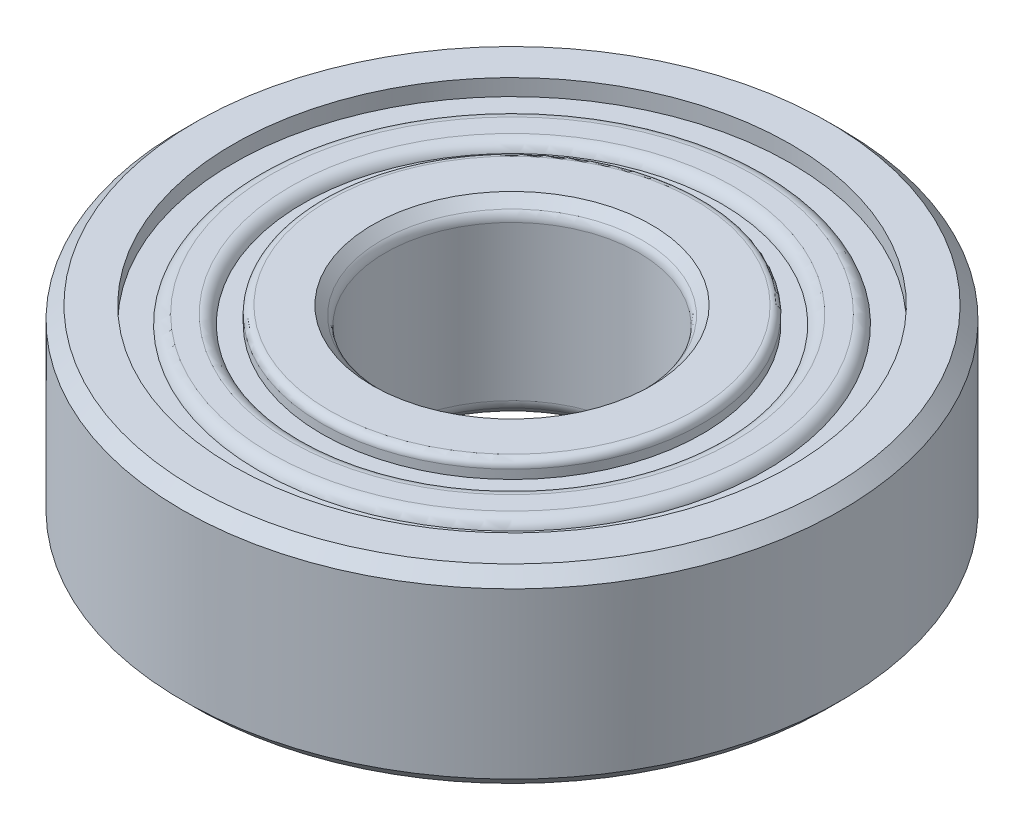
ISO-10303-21;
HEADER;
FILE_DESCRIPTION(('STEP AP214'),'2;1');
FILE_NAME('part.step','',(''),(''),'','','');
FILE_SCHEMA(('AUTOMOTIVE_DESIGN { 1 0 10303 214 1 1 1 1 }'));
ENDSEC;
DATA;
#1=APPLICATION_CONTEXT('core data for automotive mechanical design processes');
#2=APPLICATION_PROTOCOL_DEFINITION('international standard','automotive_design',2000,#1);
#3=PRODUCT_CONTEXT('',#1,'mechanical');
#4=PRODUCT('Part','Part','',(#3));
#5=PRODUCT_RELATED_PRODUCT_CATEGORY('part','',(#4));
#6=PRODUCT_DEFINITION_FORMATION('','',#4);
#7=PRODUCT_DEFINITION_CONTEXT('part definition',#1,'design');
#8=PRODUCT_DEFINITION('design','',#6,#7);
#9=PRODUCT_DEFINITION_SHAPE('','',#8);
#10=(LENGTH_UNIT() NAMED_UNIT(*) SI_UNIT(.MILLI.,.METRE.));
#11=(NAMED_UNIT(*) PLANE_ANGLE_UNIT() SI_UNIT($,.RADIAN.));
#12=(NAMED_UNIT(*) SI_UNIT($,.STERADIAN.) SOLID_ANGLE_UNIT());
#13=UNCERTAINTY_MEASURE_WITH_UNIT(LENGTH_MEASURE(1.E-05),#10,'distance_accuracy_value','');
#14=(GEOMETRIC_REPRESENTATION_CONTEXT(3) GLOBAL_UNCERTAINTY_ASSIGNED_CONTEXT((#13)) GLOBAL_UNIT_ASSIGNED_CONTEXT((#10,
#11,#12)) REPRESENTATION_CONTEXT('',''));
#15=CARTESIAN_POINT('',(0.,0.,0.));
#16=DIRECTION('',(0.,0.,1.));
#17=DIRECTION('',(1.,0.,0.));
#18=AXIS2_PLACEMENT_3D('',#15,#16,#17);
#19=CARTESIAN_POINT('',(0.,7.5,0.));
#20=DIRECTION('',(0.,-1.,0.));
#21=DIRECTION('',(0.,0.,-1.));
#22=AXIS2_PLACEMENT_3D('',#19,#20,#21);
#23=CYLINDRICAL_SURFACE('',#22,26.);
#24=CARTESIAN_POINT('',(0.,-6.49999999999998,0.));
#25=DIRECTION('',(0.,-1.,0.));
#26=DIRECTION('',(0.,0.,-1.));
#27=AXIS2_PLACEMENT_3D('',#24,#25,#26);
#28=CIRCLE('',#27,26.);
#29=CARTESIAN_POINT('',(0.,-6.49999999999998,-26.));
#30=VERTEX_POINT('',#29);
#31=EDGE_CURVE('E79',#30,#30,#28,.F.);
#32=ORIENTED_EDGE('',*,*,#31,.T.);
#33=EDGE_LOOP('',(#32));
#34=FACE_BOUND('',#33,.T.);
#35=CARTESIAN_POINT('',(0.,6.50000000000001,0.));
#36=DIRECTION('',(0.,1.,0.));
#37=DIRECTION('',(0.,0.,1.));
#38=AXIS2_PLACEMENT_3D('',#35,#36,#37);
#39=CIRCLE('',#38,26.);
#40=CARTESIAN_POINT('',(0.,6.50000000000001,26.));
#41=VERTEX_POINT('',#40);
#42=EDGE_CURVE('E119',#41,#41,#39,.F.);
#43=ORIENTED_EDGE('',*,*,#42,.T.);
#44=EDGE_LOOP('',(#43));
#45=FACE_BOUND('',#44,.T.);
#46=ADVANCED_FACE('F39',(#34,#45),#23,.T.);
#47=CARTESIAN_POINT('',(0.,7.5,0.));
#48=DIRECTION('',(0.,1.,0.));
#49=DIRECTION('',(0.,0.,1.));
#50=AXIS2_PLACEMENT_3D('',#47,#48,#49);
#51=PLANE('',#50);
#52=CARTESIAN_POINT('',(0.,7.5,0.));
#53=DIRECTION('',(0.,1.,0.));
#54=DIRECTION('',(0.,0.,1.));
#55=AXIS2_PLACEMENT_3D('',#52,#53,#54);
#56=CIRCLE('',#55,25.);
#57=CARTESIAN_POINT('',(0.,7.5,25.));
#58=VERTEX_POINT('',#57);
#59=EDGE_CURVE('E123',#58,#58,#56,.T.);
#60=ORIENTED_EDGE('',*,*,#59,.T.);
#61=EDGE_LOOP('',(#60));
#62=FACE_BOUND('',#61,.T.);
#63=CARTESIAN_POINT('',(0.,7.5,0.));
#64=DIRECTION('',(0.,1.,0.));
#65=DIRECTION('',(0.,0.,1.));
#66=AXIS2_PLACEMENT_3D('',#63,#64,#65);
#67=CIRCLE('',#66,22.);
#68=CARTESIAN_POINT('',(0.,7.5,22.));
#69=VERTEX_POINT('',#68);
#70=EDGE_CURVE('E132',#69,#69,#67,.T.);
#71=ORIENTED_EDGE('',*,*,#70,.F.);
#72=EDGE_LOOP('',(#71));
#73=FACE_BOUND('',#72,.T.);
#74=ADVANCED_FACE('F184',(#62,#73),#51,.T.);
#75=CARTESIAN_POINT('',(0.,6.2,0.));
#76=DIRECTION('',(0.,1.,0.));
#77=DIRECTION('',(0.,0.,1.));
#78=AXIS2_PLACEMENT_3D('',#75,#76,#77);
#79=CYLINDRICAL_SURFACE('',#78,22.);
#80=CARTESIAN_POINT('',(0.,6.2,0.));
#81=DIRECTION('',(0.,1.,0.));
#82=DIRECTION('',(0.,0.,1.));
#83=AXIS2_PLACEMENT_3D('',#80,#81,#82);
#84=CIRCLE('',#83,22.);
#85=CARTESIAN_POINT('',(0.,6.2,22.));
#86=VERTEX_POINT('',#85);
#87=EDGE_CURVE('E131',#86,#86,#84,.T.);
#88=ORIENTED_EDGE('',*,*,#87,.F.);
#89=EDGE_LOOP('',(#88));
#90=FACE_BOUND('',#89,.T.);
#91=ORIENTED_EDGE('',*,*,#70,.T.);
#92=EDGE_LOOP('',(#91));
#93=FACE_BOUND('',#92,.T.);
#94=ADVANCED_FACE('F190',(#90,#93),#79,.F.);
#95=CARTESIAN_POINT('',(0.,6.2,0.));
#96=DIRECTION('',(0.,1.,0.));
#97=DIRECTION('',(0.,0.,1.));
#98=AXIS2_PLACEMENT_3D('',#95,#96,#97);
#99=PLANE('',#98);
#100=CARTESIAN_POINT('',(0.,6.2,0.));
#101=DIRECTION('',(0.,1.,0.));
#102=DIRECTION('',(0.,0.,1.));
#103=AXIS2_PLACEMENT_3D('',#100,#101,#102);
#104=CIRCLE('',#103,20.);
#105=CARTESIAN_POINT('',(0.,6.2,20.));
#106=VERTEX_POINT('',#105);
#107=EDGE_CURVE('E136',#106,#106,#104,.T.);
#108=ORIENTED_EDGE('',*,*,#107,.F.);
#109=EDGE_LOOP('',(#108));
#110=FACE_BOUND('',#109,.T.);
#111=ORIENTED_EDGE('',*,*,#87,.T.);
#112=EDGE_LOOP('',(#111));
#113=FACE_BOUND('',#112,.T.);
#114=ADVANCED_FACE('F267',(#110,#113),#99,.T.);
#115=CARTESIAN_POINT('',(0.,6.9,0.));
#116=DIRECTION('',(0.,1.,0.));
#117=DIRECTION('',(0.,0.,1.));
#118=AXIS2_PLACEMENT_3D('',#115,#116,#117);
#119=PLANE('',#118);
#120=CARTESIAN_POINT('',(0.,6.9,0.));
#121=DIRECTION('',(0.,1.,0.));
#122=DIRECTION('',(0.,0.,1.));
#123=AXIS2_PLACEMENT_3D('',#120,#121,#122);
#124=CIRCLE('',#123,17.4539392014169);
#125=CARTESIAN_POINT('',(0.,6.9,17.4539392014169));
#126=VERTEX_POINT('',#125);
#127=EDGE_CURVE('E107',#126,#126,#124,.F.);
#128=ORIENTED_EDGE('',*,*,#127,.T.);
#129=EDGE_LOOP('',(#128));
#130=FACE_BOUND('',#129,.T.);
#131=CARTESIAN_POINT('',(0.,6.9,0.));
#132=DIRECTION('',(0.,1.,0.));
#133=DIRECTION('',(0.,0.,1.));
#134=AXIS2_PLACEMENT_3D('',#131,#132,#133);
#135=CIRCLE('',#134,19.0460607985831);
#136=CARTESIAN_POINT('',(0.,6.9,19.0460607985831));
#137=VERTEX_POINT('',#136);
#138=EDGE_CURVE('E111',#137,#137,#135,.T.);
#139=ORIENTED_EDGE('',*,*,#138,.T.);
#140=EDGE_LOOP('',(#139));
#141=FACE_BOUND('',#140,.T.);
#142=ADVANCED_FACE('F264',(#130,#141),#119,.T.);
#143=CARTESIAN_POINT('',(0.,6.2,0.));
#144=DIRECTION('',(0.,1.,0.));
#145=DIRECTION('',(0.,0.,1.));
#146=AXIS2_PLACEMENT_3D('',#143,#144,#145);
#147=CIRCLE('',#146,15.);
#148=CARTESIAN_POINT('',(0.,6.2,15.));
#149=VERTEX_POINT('',#148);
#150=EDGE_CURVE('E143',#149,#149,#147,.T.);
#151=ORIENTED_EDGE('',*,*,#150,.F.);
#152=EDGE_LOOP('',(#151));
#153=FACE_BOUND('',#152,.T.);
#154=CARTESIAN_POINT('',(0.,6.2,0.));
#155=DIRECTION('',(0.,1.,0.));
#156=DIRECTION('',(0.,0.,1.));
#157=AXIS2_PLACEMENT_3D('',#154,#155,#156);
#158=CIRCLE('',#157,16.5);
#159=CARTESIAN_POINT('',(0.,6.2,16.5));
#160=VERTEX_POINT('',#159);
#161=EDGE_CURVE('E127',#160,#160,#158,.F.);
#162=ORIENTED_EDGE('',*,*,#161,.F.);
#163=EDGE_LOOP('',(#162));
#164=FACE_BOUND('',#163,.T.);
#165=ADVANCED_FACE('F261',(#153,#164),#99,.T.);
#166=CARTESIAN_POINT('',(0.,7.5,0.));
#167=DIRECTION('',(0.,1.,0.));
#168=DIRECTION('',(0.,0.,1.));
#169=AXIS2_PLACEMENT_3D('',#166,#167,#168);
#170=PLANE('',#169);
#171=CARTESIAN_POINT('',(0.,7.5,0.));
#172=DIRECTION('',(0.,1.,0.));
#173=DIRECTION('',(0.,0.,1.));
#174=AXIS2_PLACEMENT_3D('',#171,#172,#173);
#175=CIRCLE('',#174,14.4);
#176=CARTESIAN_POINT('',(0.,7.5,14.4));
#177=VERTEX_POINT('',#176);
#178=EDGE_CURVE('E95',#177,#177,#175,.T.);
#179=ORIENTED_EDGE('',*,*,#178,.T.);
#180=EDGE_LOOP('',(#179));
#181=FACE_BOUND('',#180,.T.);
#182=CARTESIAN_POINT('',(0.,7.5,0.));
#183=DIRECTION('',(0.,1.,0.));
#184=DIRECTION('',(0.,0.,1.));
#185=AXIS2_PLACEMENT_3D('',#182,#183,#184);
#186=CIRCLE('',#185,11.);
#187=CARTESIAN_POINT('',(0.,7.5,11.));
#188=VERTEX_POINT('',#187);
#189=EDGE_CURVE('E115',#188,#188,#186,.F.);
#190=ORIENTED_EDGE('',*,*,#189,.T.);
#191=EDGE_LOOP('',(#190));
#192=FACE_BOUND('',#191,.T.);
#193=ADVANCED_FACE('F255',(#181,#192),#170,.T.);
#194=CARTESIAN_POINT('',(0.,7.5,0.));
#195=DIRECTION('',(0.,-1.,0.));
#196=DIRECTION('',(0.,0.,-1.));
#197=AXIS2_PLACEMENT_3D('',#194,#195,#196);
#198=CYLINDRICAL_SURFACE('',#197,15.);
#199=CARTESIAN_POINT('',(0.,6.9,0.));
#200=DIRECTION('',(0.,1.,0.));
#201=DIRECTION('',(0.,0.,1.));
#202=AXIS2_PLACEMENT_3D('',#199,#200,#201);
#203=CIRCLE('',#202,15.);
#204=CARTESIAN_POINT('',(0.,6.9,15.));
#205=VERTEX_POINT('',#204);
#206=EDGE_CURVE('E91',#205,#205,#203,.F.);
#207=ORIENTED_EDGE('',*,*,#206,.T.);
#208=EDGE_LOOP('',(#207));
#209=FACE_BOUND('',#208,.T.);
#210=ORIENTED_EDGE('',*,*,#150,.T.);
#211=EDGE_LOOP('',(#210));
#212=FACE_BOUND('',#211,.T.);
#213=ADVANCED_FACE('F248',(#209,#212),#198,.T.);
#214=CARTESIAN_POINT('',(0.,7.5,0.));
#215=DIRECTION('',(0.,-1.,0.));
#216=DIRECTION('',(0.,0.,-1.));
#217=AXIS2_PLACEMENT_3D('',#214,#215,#216);
#218=CYLINDRICAL_SURFACE('',#217,10.);
#219=CARTESIAN_POINT('',(0.,-6.08578643762689,0.));
#220=DIRECTION('',(0.,1.,0.));
#221=DIRECTION('',(0.,0.,1.));
#222=AXIS2_PLACEMENT_3D('',#219,#220,#221);
#223=CIRCLE('',#222,10.);
#224=CARTESIAN_POINT('',(0.,-6.08578643762689,10.));
#225=VERTEX_POINT('',#224);
#226=EDGE_CURVE('E57',#225,#225,#223,.F.);
#227=ORIENTED_EDGE('',*,*,#226,.T.);
#228=EDGE_LOOP('',(#227));
#229=FACE_BOUND('',#228,.T.);
#230=CARTESIAN_POINT('',(0.,6.08578643762689,0.));
#231=DIRECTION('',(0.,-1.,0.));
#232=DIRECTION('',(0.,0.,-1.));
#233=AXIS2_PLACEMENT_3D('',#230,#231,#232);
#234=CIRCLE('',#233,10.);
#235=CARTESIAN_POINT('',(0.,6.08578643762689,-10.));
#236=VERTEX_POINT('',#235);
#237=EDGE_CURVE('E103',#236,#236,#234,.F.);
#238=ORIENTED_EDGE('',*,*,#237,.T.);
#239=EDGE_LOOP('',(#238));
#240=FACE_BOUND('',#239,.T.);
#241=ADVANCED_FACE('F200',(#229,#240),#218,.F.);
#242=CARTESIAN_POINT('',(0.,7.5,0.));
#243=DIRECTION('',(0.,-1.,0.));
#244=DIRECTION('',(0.,0.,-1.));
#245=AXIS2_PLACEMENT_3D('',#242,#243,#244);
#246=CONICAL_SURFACE('',#245,25.,0.785398163397453);
#247=ORIENTED_EDGE('',*,*,#42,.F.);
#248=EDGE_LOOP('',(#247));
#249=FACE_BOUND('',#248,.T.);
#250=ORIENTED_EDGE('',*,*,#59,.F.);
#251=EDGE_LOOP('',(#250));
#252=FACE_BOUND('',#251,.T.);
#253=ADVANCED_FACE('F196',(#249,#252),#246,.T.);
#254=CARTESIAN_POINT('',(0.,6.49999999999999,0.));
#255=DIRECTION('',(0.,1.,0.));
#256=DIRECTION('',(0.,0.,1.));
#257=AXIS2_PLACEMENT_3D('',#254,#255,#256);
#258=CONICAL_SURFACE('',#257,10.,0.785398163397452);
#259=CARTESIAN_POINT('',(0.,6.79289321881344,0.));
#260=DIRECTION('',(0.,-1.,0.));
#261=DIRECTION('',(0.,0.,-1.));
#262=AXIS2_PLACEMENT_3D('',#259,#260,#261);
#263=CIRCLE('',#262,10.2928932188135);
#264=CARTESIAN_POINT('',(0.,6.79289321881344,-10.2928932188135));
#265=VERTEX_POINT('',#264);
#266=EDGE_CURVE('E99',#265,#265,#263,.T.);
#267=ORIENTED_EDGE('',*,*,#266,.T.);
#268=EDGE_LOOP('',(#267));
#269=FACE_BOUND('',#268,.T.);
#270=ORIENTED_EDGE('',*,*,#189,.F.);
#271=EDGE_LOOP('',(#270));
#272=FACE_BOUND('',#271,.T.);
#273=ADVANCED_FACE('F199',(#269,#272),#258,.F.);
#274=CARTESIAN_POINT('',(0.,5.9,0.));
#275=DIRECTION('',(0.,1.,0.));
#276=DIRECTION('',(0.,0.,1.));
#277=AXIS2_PLACEMENT_3D('',#274,#275,#276);
#278=TOROIDAL_SURFACE('',#277,17.4539392014169,1.);
#279=ORIENTED_EDGE('',*,*,#127,.F.);
#280=EDGE_LOOP('',(#279));
#281=FACE_BOUND('',#280,.T.);
#282=ORIENTED_EDGE('',*,*,#161,.T.);
#283=EDGE_LOOP('',(#282));
#284=FACE_BOUND('',#283,.T.);
#285=ADVANCED_FACE('F204',(#281,#284),#278,.T.);
#286=CARTESIAN_POINT('',(0.,5.9,0.));
#287=DIRECTION('',(0.,-1.,0.));
#288=DIRECTION('',(0.,0.,-1.));
#289=AXIS2_PLACEMENT_3D('',#286,#287,#288);
#290=TOROIDAL_SURFACE('',#289,19.0460607985831,1.);
#291=ORIENTED_EDGE('',*,*,#107,.T.);
#292=EDGE_LOOP('',(#291));
#293=FACE_BOUND('',#292,.T.);
#294=ORIENTED_EDGE('',*,*,#138,.F.);
#295=EDGE_LOOP('',(#294));
#296=FACE_BOUND('',#295,.T.);
#297=ADVANCED_FACE('F208',(#293,#296),#290,.T.);
#298=CARTESIAN_POINT('',(0.,6.08578643762689,0.));
#299=DIRECTION('',(0.,-1.,0.));
#300=DIRECTION('',(0.,0.,-1.));
#301=AXIS2_PLACEMENT_3D('',#298,#299,#300);
#302=TOROIDAL_SURFACE('',#301,11.,1.);
#303=ORIENTED_EDGE('',*,*,#266,.F.);
#304=EDGE_LOOP('',(#303));
#305=FACE_BOUND('',#304,.T.);
#306=ORIENTED_EDGE('',*,*,#237,.F.);
#307=EDGE_LOOP('',(#306));
#308=FACE_BOUND('',#307,.T.);
#309=ADVANCED_FACE('F212',(#305,#308),#302,.T.);
#310=CARTESIAN_POINT('',(0.,6.9,0.));
#311=DIRECTION('',(0.,1.,0.));
#312=DIRECTION('',(0.,0.,1.));
#313=AXIS2_PLACEMENT_3D('',#310,#311,#312);
#314=TOROIDAL_SURFACE('',#313,14.4,0.6);
#315=ORIENTED_EDGE('',*,*,#206,.F.);
#316=EDGE_LOOP('',(#315));
#317=FACE_BOUND('',#316,.T.);
#318=ORIENTED_EDGE('',*,*,#178,.F.);
#319=EDGE_LOOP('',(#318));
#320=FACE_BOUND('',#319,.T.);
#321=ADVANCED_FACE('F216',(#317,#320),#314,.T.);
#322=CARTESIAN_POINT('',(0.,-7.5,0.));
#323=DIRECTION('',(0.,-1.,0.));
#324=DIRECTION('',(0.,0.,1.));
#325=AXIS2_PLACEMENT_3D('',#322,#323,#324);
#326=PLANE('',#325);
#327=CARTESIAN_POINT('',(0.,-7.5,0.));
#328=DIRECTION('',(0.,-1.,0.));
#329=DIRECTION('',(0.,0.,-1.));
#330=AXIS2_PLACEMENT_3D('',#327,#328,#329);
#331=CIRCLE('',#330,25.);
#332=CARTESIAN_POINT('',(0.,-7.5,-25.));
#333=VERTEX_POINT('',#332);
#334=EDGE_CURVE('E75',#333,#333,#331,.T.);
#335=ORIENTED_EDGE('',*,*,#334,.T.);
#336=EDGE_LOOP('',(#335));
#337=FACE_BOUND('',#336,.T.);
#338=CARTESIAN_POINT('',(0.,-7.5,0.));
#339=DIRECTION('',(0.,1.,0.));
#340=DIRECTION('',(0.,0.,1.));
#341=AXIS2_PLACEMENT_3D('',#338,#339,#340);
#342=CIRCLE('',#341,22.);
#343=CARTESIAN_POINT('',(0.,-7.5,22.));
#344=VERTEX_POINT('',#343);
#345=EDGE_CURVE('E148',#344,#344,#342,.T.);
#346=ORIENTED_EDGE('',*,*,#345,.T.);
#347=EDGE_LOOP('',(#346));
#348=FACE_BOUND('',#347,.T.);
#349=ADVANCED_FACE('F220',(#337,#348),#326,.T.);
#350=CARTESIAN_POINT('',(0.,-6.2,0.));
#351=DIRECTION('',(0.,-1.,0.));
#352=DIRECTION('',(0.,0.,-1.));
#353=AXIS2_PLACEMENT_3D('',#350,#351,#352);
#354=CYLINDRICAL_SURFACE('',#353,22.);
#355=CARTESIAN_POINT('',(0.,-6.2,0.));
#356=DIRECTION('',(0.,1.,0.));
#357=DIRECTION('',(0.,0.,1.));
#358=AXIS2_PLACEMENT_3D('',#355,#356,#357);
#359=CIRCLE('',#358,22.);
#360=CARTESIAN_POINT('',(0.,-6.2,22.));
#361=VERTEX_POINT('',#360);
#362=EDGE_CURVE('E147',#361,#361,#359,.T.);
#363=ORIENTED_EDGE('',*,*,#362,.T.);
#364=EDGE_LOOP('',(#363));
#365=FACE_BOUND('',#364,.T.);
#366=ORIENTED_EDGE('',*,*,#345,.F.);
#367=EDGE_LOOP('',(#366));
#368=FACE_BOUND('',#367,.T.);
#369=ADVANCED_FACE('F181',(#365,#368),#354,.F.);
#370=CARTESIAN_POINT('',(0.,-6.2,0.));
#371=DIRECTION('',(0.,-1.,0.));
#372=DIRECTION('',(0.,0.,1.));
#373=AXIS2_PLACEMENT_3D('',#370,#371,#372);
#374=PLANE('',#373);
#375=CARTESIAN_POINT('',(0.,-6.2,0.));
#376=DIRECTION('',(0.,-1.,0.));
#377=DIRECTION('',(0.,0.,-1.));
#378=AXIS2_PLACEMENT_3D('',#375,#376,#377);
#379=CIRCLE('',#378,20.);
#380=CARTESIAN_POINT('',(0.,-6.2,-20.));
#381=VERTEX_POINT('',#380);
#382=EDGE_CURVE('E87',#381,#381,#379,.T.);
#383=ORIENTED_EDGE('',*,*,#382,.F.);
#384=EDGE_LOOP('',(#383));
#385=FACE_BOUND('',#384,.T.);
#386=ORIENTED_EDGE('',*,*,#362,.F.);
#387=EDGE_LOOP('',(#386));
#388=FACE_BOUND('',#387,.T.);
#389=ADVANCED_FACE('F169',(#385,#388),#374,.T.);
#390=CARTESIAN_POINT('',(0.,-6.9,0.));
#391=DIRECTION('',(0.,-1.,0.));
#392=DIRECTION('',(0.,0.,1.));
#393=AXIS2_PLACEMENT_3D('',#390,#391,#392);
#394=PLANE('',#393);
#395=CARTESIAN_POINT('',(0.,-6.9,0.));
#396=DIRECTION('',(0.,-1.,0.));
#397=DIRECTION('',(0.,0.,-1.));
#398=AXIS2_PLACEMENT_3D('',#395,#396,#397);
#399=CIRCLE('',#398,17.4539392014169);
#400=CARTESIAN_POINT('',(0.,-6.9,-17.4539392014169));
#401=VERTEX_POINT('',#400);
#402=EDGE_CURVE('E63',#401,#401,#399,.F.);
#403=ORIENTED_EDGE('',*,*,#402,.T.);
#404=EDGE_LOOP('',(#403));
#405=FACE_BOUND('',#404,.T.);
#406=CARTESIAN_POINT('',(0.,-6.9,0.));
#407=DIRECTION('',(0.,-1.,0.));
#408=DIRECTION('',(0.,0.,-1.));
#409=AXIS2_PLACEMENT_3D('',#406,#407,#408);
#410=CIRCLE('',#409,19.0460607985831);
#411=CARTESIAN_POINT('',(0.,-6.9,-19.0460607985831));
#412=VERTEX_POINT('',#411);
#413=EDGE_CURVE('E67',#412,#412,#410,.T.);
#414=ORIENTED_EDGE('',*,*,#413,.T.);
#415=EDGE_LOOP('',(#414));
#416=FACE_BOUND('',#415,.T.);
#417=ADVANCED_FACE('F166',(#405,#416),#394,.T.);
#418=CARTESIAN_POINT('',(0.,-6.2,0.));
#419=DIRECTION('',(0.,-1.,0.));
#420=DIRECTION('',(0.,0.,-1.));
#421=AXIS2_PLACEMENT_3D('',#418,#419,#420);
#422=CIRCLE('',#421,15.);
#423=CARTESIAN_POINT('',(0.,-6.2,-15.));
#424=VERTEX_POINT('',#423);
#425=EDGE_CURVE('E83',#424,#424,#422,.T.);
#426=ORIENTED_EDGE('',*,*,#425,.F.);
#427=EDGE_LOOP('',(#426));
#428=FACE_BOUND('',#427,.T.);
#429=CARTESIAN_POINT('',(0.,-6.2,0.));
#430=DIRECTION('',(0.,1.,0.));
#431=DIRECTION('',(0.,0.,1.));
#432=AXIS2_PLACEMENT_3D('',#429,#430,#431);
#433=CIRCLE('',#432,16.5);
#434=CARTESIAN_POINT('',(0.,-6.2,16.5));
#435=VERTEX_POINT('',#434);
#436=EDGE_CURVE('E152',#435,#435,#433,.T.);
#437=ORIENTED_EDGE('',*,*,#436,.F.);
#438=EDGE_LOOP('',(#437));
#439=FACE_BOUND('',#438,.T.);
#440=ADVANCED_FACE('F163',(#428,#439),#374,.T.);
#441=CARTESIAN_POINT('',(0.,-7.5,0.));
#442=DIRECTION('',(0.,1.,0.));
#443=DIRECTION('',(0.,0.,1.));
#444=AXIS2_PLACEMENT_3D('',#441,#442,#443);
#445=CYLINDRICAL_SURFACE('',#444,15.);
#446=CARTESIAN_POINT('',(0.,-6.9,0.));
#447=DIRECTION('',(0.,-1.,0.));
#448=DIRECTION('',(0.,0.,-1.));
#449=AXIS2_PLACEMENT_3D('',#446,#447,#448);
#450=CIRCLE('',#449,15.);
#451=CARTESIAN_POINT('',(0.,-6.9,-15.));
#452=VERTEX_POINT('',#451);
#453=EDGE_CURVE('E47',#452,#452,#450,.F.);
#454=ORIENTED_EDGE('',*,*,#453,.T.);
#455=EDGE_LOOP('',(#454));
#456=FACE_BOUND('',#455,.T.);
#457=ORIENTED_EDGE('',*,*,#425,.T.);
#458=EDGE_LOOP('',(#457));
#459=FACE_BOUND('',#458,.T.);
#460=ADVANCED_FACE('F165',(#456,#459),#445,.T.);
#461=CARTESIAN_POINT('',(0.,-7.5,0.));
#462=DIRECTION('',(0.,-1.,0.));
#463=DIRECTION('',(0.,0.,1.));
#464=AXIS2_PLACEMENT_3D('',#461,#462,#463);
#465=PLANE('',#464);
#466=CARTESIAN_POINT('',(0.,-7.5,0.));
#467=DIRECTION('',(0.,-1.,0.));
#468=DIRECTION('',(0.,0.,-1.));
#469=AXIS2_PLACEMENT_3D('',#466,#467,#468);
#470=CIRCLE('',#469,14.4);
#471=CARTESIAN_POINT('',(0.,-7.5,-14.4));
#472=VERTEX_POINT('',#471);
#473=EDGE_CURVE('E10',#472,#472,#470,.T.);
#474=ORIENTED_EDGE('',*,*,#473,.T.);
#475=EDGE_LOOP('',(#474));
#476=FACE_BOUND('',#475,.T.);
#477=CARTESIAN_POINT('',(0.,-7.5,0.));
#478=DIRECTION('',(0.,-1.,0.));
#479=DIRECTION('',(0.,0.,-1.));
#480=AXIS2_PLACEMENT_3D('',#477,#478,#479);
#481=CIRCLE('',#480,11.);
#482=CARTESIAN_POINT('',(0.,-7.5,-11.));
#483=VERTEX_POINT('',#482);
#484=EDGE_CURVE('E71',#483,#483,#481,.F.);
#485=ORIENTED_EDGE('',*,*,#484,.T.);
#486=EDGE_LOOP('',(#485));
#487=FACE_BOUND('',#486,.T.);
#488=ADVANCED_FACE('F174',(#476,#487),#465,.T.);
#489=CARTESIAN_POINT('',(0.,-6.49999999999998,0.));
#490=DIRECTION('',(0.,1.,0.));
#491=DIRECTION('',(0.,0.,1.));
#492=AXIS2_PLACEMENT_3D('',#489,#490,#491);
#493=CONICAL_SURFACE('',#492,26.,0.785398163397443);
#494=ORIENTED_EDGE('',*,*,#334,.F.);
#495=EDGE_LOOP('',(#494));
#496=FACE_BOUND('',#495,.T.);
#497=ORIENTED_EDGE('',*,*,#31,.F.);
#498=EDGE_LOOP('',(#497));
#499=FACE_BOUND('',#498,.T.);
#500=ADVANCED_FACE('F222',(#496,#499),#493,.T.);
#501=CARTESIAN_POINT('',(0.,-7.5,0.));
#502=DIRECTION('',(0.,-1.,0.));
#503=DIRECTION('',(0.,0.,-1.));
#504=AXIS2_PLACEMENT_3D('',#501,#502,#503);
#505=CONICAL_SURFACE('',#504,11.,0.785398163397453);
#506=CARTESIAN_POINT('',(0.,-6.79289321881344,0.));
#507=DIRECTION('',(0.,1.,0.));
#508=DIRECTION('',(0.,0.,1.));
#509=AXIS2_PLACEMENT_3D('',#506,#507,#508);
#510=CIRCLE('',#509,10.2928932188135);
#511=CARTESIAN_POINT('',(0.,-6.79289321881344,10.2928932188135));
#512=VERTEX_POINT('',#511);
#513=EDGE_CURVE('E52',#512,#512,#510,.T.);
#514=ORIENTED_EDGE('',*,*,#513,.T.);
#515=EDGE_LOOP('',(#514));
#516=FACE_BOUND('',#515,.T.);
#517=ORIENTED_EDGE('',*,*,#484,.F.);
#518=EDGE_LOOP('',(#517));
#519=FACE_BOUND('',#518,.T.);
#520=ADVANCED_FACE('F225',(#516,#519),#505,.F.);
#521=CARTESIAN_POINT('',(0.,-5.9,0.));
#522=DIRECTION('',(0.,-1.,0.));
#523=DIRECTION('',(0.,0.,-1.));
#524=AXIS2_PLACEMENT_3D('',#521,#522,#523);
#525=TOROIDAL_SURFACE('',#524,17.4539392014169,1.);
#526=ORIENTED_EDGE('',*,*,#436,.T.);
#527=EDGE_LOOP('',(#526));
#528=FACE_BOUND('',#527,.T.);
#529=ORIENTED_EDGE('',*,*,#402,.F.);
#530=EDGE_LOOP('',(#529));
#531=FACE_BOUND('',#530,.T.);
#532=ADVANCED_FACE('F160',(#528,#531),#525,.T.);
#533=CARTESIAN_POINT('',(0.,-5.9,0.));
#534=DIRECTION('',(0.,1.,0.));
#535=DIRECTION('',(0.,0.,1.));
#536=AXIS2_PLACEMENT_3D('',#533,#534,#535);
#537=TOROIDAL_SURFACE('',#536,19.0460607985831,1.);
#538=ORIENTED_EDGE('',*,*,#413,.F.);
#539=EDGE_LOOP('',(#538));
#540=FACE_BOUND('',#539,.T.);
#541=ORIENTED_EDGE('',*,*,#382,.T.);
#542=EDGE_LOOP('',(#541));
#543=FACE_BOUND('',#542,.T.);
#544=ADVANCED_FACE('F232',(#540,#543),#537,.T.);
#545=CARTESIAN_POINT('',(0.,-6.08578643762689,0.));
#546=DIRECTION('',(0.,1.,0.));
#547=DIRECTION('',(0.,0.,1.));
#548=AXIS2_PLACEMENT_3D('',#545,#546,#547);
#549=TOROIDAL_SURFACE('',#548,11.,1.);
#550=ORIENTED_EDGE('',*,*,#513,.F.);
#551=EDGE_LOOP('',(#550));
#552=FACE_BOUND('',#551,.T.);
#553=ORIENTED_EDGE('',*,*,#226,.F.);
#554=EDGE_LOOP('',(#553));
#555=FACE_BOUND('',#554,.T.);
#556=ADVANCED_FACE('F234',(#552,#555),#549,.T.);
#557=CARTESIAN_POINT('',(0.,-6.9,0.));
#558=DIRECTION('',(0.,-1.,0.));
#559=DIRECTION('',(0.,0.,-1.));
#560=AXIS2_PLACEMENT_3D('',#557,#558,#559);
#561=TOROIDAL_SURFACE('',#560,14.4,0.6);
#562=ORIENTED_EDGE('',*,*,#473,.F.);
#563=EDGE_LOOP('',(#562));
#564=FACE_BOUND('',#563,.T.);
#565=ORIENTED_EDGE('',*,*,#453,.F.);
#566=EDGE_LOOP('',(#565));
#567=FACE_BOUND('',#566,.T.);
#568=ADVANCED_FACE('F41',(#564,#567),#561,.T.);
#569=CLOSED_SHELL('',(#46,#74,#94,#114,#142,#165,#193,#213,#241,#253,#273,#285,#297,#309,#321,
#349,#369,#389,#417,#440,#460,#488,#500,#520,#532,#544,#556,#568));
#570=MANIFOLD_SOLID_BREP('B2',#569);
#571=ADVANCED_BREP_SHAPE_REPRESENTATION('',(#18,#570),#14);
#572=SHAPE_DEFINITION_REPRESENTATION(#9,#571);
ENDSEC;
END-ISO-10303-21;
